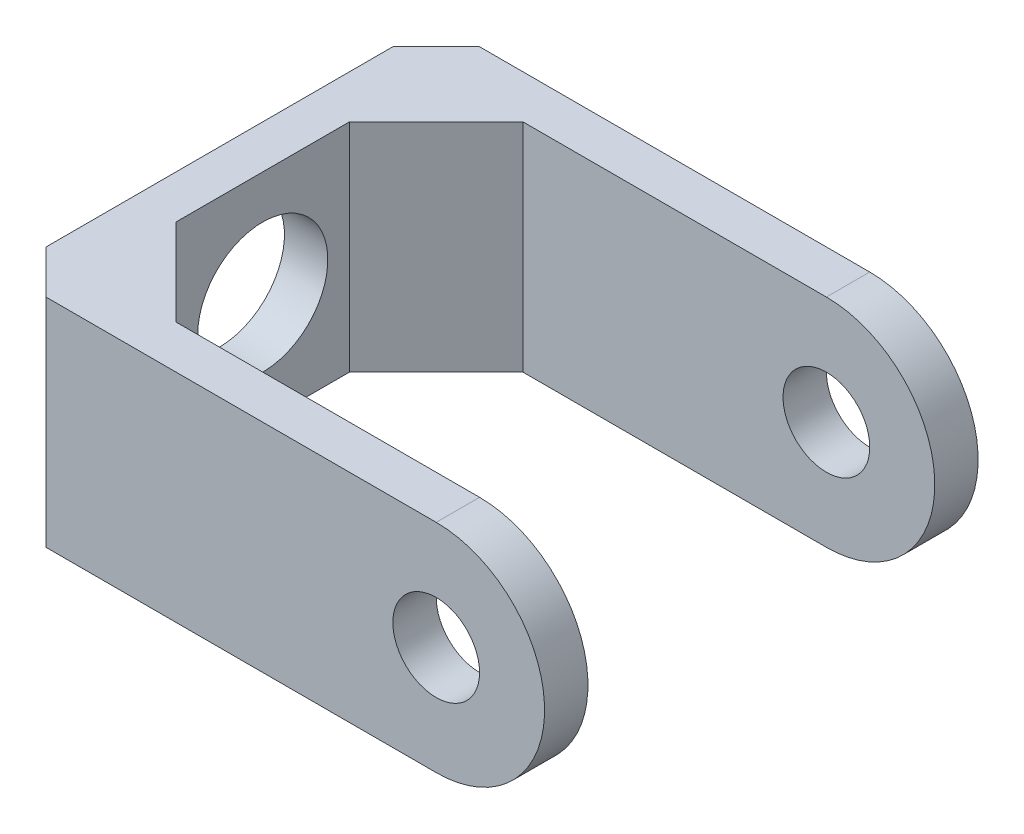
ISO-10303-21;
HEADER;
FILE_DESCRIPTION(('STEP AP214'),'2;1');
FILE_NAME('part.step','',(''),(''),'','','');
FILE_SCHEMA(('AUTOMOTIVE_DESIGN { 1 0 10303 214 1 1 1 1 }'));
ENDSEC;
DATA;
#1=APPLICATION_CONTEXT('core data for automotive mechanical design processes');
#2=APPLICATION_PROTOCOL_DEFINITION('international standard','automotive_design',2000,#1);
#3=PRODUCT_CONTEXT('',#1,'mechanical');
#4=PRODUCT('Part','Part','',(#3));
#5=PRODUCT_RELATED_PRODUCT_CATEGORY('part','',(#4));
#6=PRODUCT_DEFINITION_FORMATION('','',#4);
#7=PRODUCT_DEFINITION_CONTEXT('part definition',#1,'design');
#8=PRODUCT_DEFINITION('design','',#6,#7);
#9=PRODUCT_DEFINITION_SHAPE('','',#8);
#10=(LENGTH_UNIT() NAMED_UNIT(*) SI_UNIT(.MILLI.,.METRE.));
#11=(NAMED_UNIT(*) PLANE_ANGLE_UNIT() SI_UNIT($,.RADIAN.));
#12=(NAMED_UNIT(*) SI_UNIT($,.STERADIAN.) SOLID_ANGLE_UNIT());
#13=UNCERTAINTY_MEASURE_WITH_UNIT(LENGTH_MEASURE(1.E-05),#10,'distance_accuracy_value','');
#14=(GEOMETRIC_REPRESENTATION_CONTEXT(3) GLOBAL_UNCERTAINTY_ASSIGNED_CONTEXT((#13)) GLOBAL_UNIT_ASSIGNED_CONTEXT((#10,
#11,#12)) REPRESENTATION_CONTEXT('',''));
#15=CARTESIAN_POINT('',(0.,0.,0.));
#16=DIRECTION('',(0.,0.,1.));
#17=DIRECTION('',(1.,0.,0.));
#18=AXIS2_PLACEMENT_3D('',#15,#16,#17);
#19=CARTESIAN_POINT('',(18.,5.,2.));
#20=DIRECTION('',(0.,0.,1.));
#21=DIRECTION('',(1.,0.,0.));
#22=AXIS2_PLACEMENT_3D('',#19,#20,#21);
#23=PLANE('',#22);
#24=DIRECTION('',(-1.,0.,0.));
#25=VECTOR('',#24,1.);
#26=CARTESIAN_POINT('',(0.,10.,2.));
#27=LINE('',#26,#25);
#28=CARTESIAN_POINT('',(18.,10.,2.));
#29=VERTEX_POINT('',#28);
#30=CARTESIAN_POINT('',(4.00000000000003,10.,2.));
#31=VERTEX_POINT('',#30);
#32=EDGE_CURVE('E214',#29,#31,#27,.T.);
#33=ORIENTED_EDGE('',*,*,#32,.T.);
#34=DIRECTION('',(0.,-1.,0.));
#35=VECTOR('',#34,1.);
#36=CARTESIAN_POINT('',(4.00000000000003,5.,2.));
#37=LINE('',#36,#35);
#38=CARTESIAN_POINT('',(4.00000000000003,0.,2.));
#39=VERTEX_POINT('',#38);
#40=EDGE_CURVE('E269',#31,#39,#37,.T.);
#41=ORIENTED_EDGE('',*,*,#40,.T.);
#42=DIRECTION('',(1.,0.,0.));
#43=VECTOR('',#42,1.);
#44=CARTESIAN_POINT('',(0.,0.,2.));
#45=LINE('',#44,#43);
#46=CARTESIAN_POINT('',(18.,0.,2.));
#47=VERTEX_POINT('',#46);
#48=EDGE_CURVE('E207',#39,#47,#45,.T.);
#49=ORIENTED_EDGE('',*,*,#48,.T.);
#50=CARTESIAN_POINT('',(18.,5.,2.));
#51=DIRECTION('',(0.,0.,1.));
#52=DIRECTION('',(1.,0.,0.));
#53=AXIS2_PLACEMENT_3D('',#50,#51,#52);
#54=CIRCLE('',#53,5.);
#55=EDGE_CURVE('E210',#47,#29,#54,.T.);
#56=ORIENTED_EDGE('',*,*,#55,.T.);
#57=EDGE_LOOP('',(#33,#41,#49,#56));
#58=FACE_BOUND('',#57,.T.);
#59=CARTESIAN_POINT('',(18.,5.,2.));
#60=DIRECTION('',(0.,0.,1.));
#61=DIRECTION('',(1.,0.,0.));
#62=AXIS2_PLACEMENT_3D('',#59,#60,#61);
#63=CIRCLE('',#62,2.);
#64=CARTESIAN_POINT('',(20.,5.,2.));
#65=VERTEX_POINT('',#64);
#66=EDGE_CURVE('E199',#65,#65,#63,.T.);
#67=ORIENTED_EDGE('',*,*,#66,.F.);
#68=EDGE_LOOP('',(#67));
#69=FACE_BOUND('',#68,.T.);
#70=ADVANCED_FACE('F47',(#58,#69),#23,.T.);
#71=CARTESIAN_POINT('',(18.,5.,0.));
#72=DIRECTION('',(0.,0.,1.));
#73=DIRECTION('',(1.,0.,0.));
#74=AXIS2_PLACEMENT_3D('',#71,#72,#73);
#75=PLANE('',#74);
#76=DIRECTION('',(1.,0.,0.));
#77=VECTOR('',#76,1.);
#78=CARTESIAN_POINT('',(0.,0.,0.));
#79=LINE('',#78,#77);
#80=CARTESIAN_POINT('',(0.,0.,0.));
#81=VERTEX_POINT('',#80);
#82=CARTESIAN_POINT('',(18.,0.,0.));
#83=VERTEX_POINT('',#82);
#84=EDGE_CURVE('E203',#81,#83,#79,.T.);
#85=ORIENTED_EDGE('',*,*,#84,.F.);
#86=DIRECTION('',(0.,1.,0.));
#87=VECTOR('',#86,1.);
#88=CARTESIAN_POINT('',(0.,10.,0.));
#89=LINE('',#88,#87);
#90=CARTESIAN_POINT('',(0.,10.,0.));
#91=VERTEX_POINT('',#90);
#92=EDGE_CURVE('E256',#81,#91,#89,.T.);
#93=ORIENTED_EDGE('',*,*,#92,.T.);
#94=DIRECTION('',(-1.,0.,0.));
#95=VECTOR('',#94,1.);
#96=CARTESIAN_POINT('',(0.,10.,0.));
#97=LINE('',#96,#95);
#98=CARTESIAN_POINT('',(18.,10.,0.));
#99=VERTEX_POINT('',#98);
#100=EDGE_CURVE('E211',#99,#91,#97,.T.);
#101=ORIENTED_EDGE('',*,*,#100,.F.);
#102=CARTESIAN_POINT('',(18.,5.,0.));
#103=DIRECTION('',(0.,0.,1.));
#104=DIRECTION('',(1.,0.,0.));
#105=AXIS2_PLACEMENT_3D('',#102,#103,#104);
#106=CIRCLE('',#105,5.);
#107=EDGE_CURVE('E220',#83,#99,#106,.T.);
#108=ORIENTED_EDGE('',*,*,#107,.F.);
#109=EDGE_LOOP('',(#85,#93,#101,#108));
#110=FACE_BOUND('',#109,.T.);
#111=CARTESIAN_POINT('',(18.,5.,0.));
#112=DIRECTION('',(0.,0.,1.));
#113=DIRECTION('',(1.,0.,0.));
#114=AXIS2_PLACEMENT_3D('',#111,#112,#113);
#115=CIRCLE('',#114,2.);
#116=CARTESIAN_POINT('',(20.,5.,0.));
#117=VERTEX_POINT('',#116);
#118=EDGE_CURVE('E198',#117,#117,#115,.T.);
#119=ORIENTED_EDGE('',*,*,#118,.T.);
#120=EDGE_LOOP('',(#119));
#121=FACE_BOUND('',#120,.T.);
#122=ADVANCED_FACE('F297',(#110,#121),#75,.F.);
#123=CARTESIAN_POINT('',(0.,0.,2.));
#124=DIRECTION('',(0.,1.,0.));
#125=DIRECTION('',(0.,0.,1.));
#126=AXIS2_PLACEMENT_3D('',#123,#124,#125);
#127=PLANE('',#126);
#128=DIRECTION('',(1.,0.,0.));
#129=VECTOR('',#128,1.);
#130=CARTESIAN_POINT('',(-2.,0.,20.));
#131=LINE('',#130,#129);
#132=CARTESIAN_POINT('',(0.,0.,20.));
#133=VERTEX_POINT('',#132);
#134=CARTESIAN_POINT('',(18.,0.,20.));
#135=VERTEX_POINT('',#134);
#136=EDGE_CURVE('E195',#133,#135,#131,.T.);
#137=ORIENTED_EDGE('',*,*,#136,.F.);
#138=DIRECTION('',(-0.707106781186549,0.,-0.707106781186546));
#139=VECTOR('',#138,1.);
#140=CARTESIAN_POINT('',(-2.,0.,18.));
#141=LINE('',#140,#139);
#142=CARTESIAN_POINT('',(-2.,0.,18.));
#143=VERTEX_POINT('',#142);
#144=EDGE_CURVE('E253',#133,#143,#141,.T.);
#145=ORIENTED_EDGE('',*,*,#144,.T.);
#146=DIRECTION('',(0.,0.,1.));
#147=VECTOR('',#146,1.);
#148=CARTESIAN_POINT('',(-2.,0.,0.));
#149=LINE('',#148,#147);
#150=CARTESIAN_POINT('',(-2.,0.,2.));
#151=VERTEX_POINT('',#150);
#152=EDGE_CURVE('E179',#151,#143,#149,.T.);
#153=ORIENTED_EDGE('',*,*,#152,.F.);
#154=DIRECTION('',(0.707106781186549,0.,-0.707106781186546));
#155=VECTOR('',#154,1.);
#156=CARTESIAN_POINT('',(-2.,0.,2.));
#157=LINE('',#156,#155);
#158=EDGE_CURVE('E250',#151,#81,#157,.T.);
#159=ORIENTED_EDGE('',*,*,#158,.T.);
#160=ORIENTED_EDGE('',*,*,#84,.T.);
#161=DIRECTION('',(0.,0.,-1.));
#162=VECTOR('',#161,1.);
#163=CARTESIAN_POINT('',(18.,0.,2.));
#164=LINE('',#163,#162);
#165=EDGE_CURVE('E229',#47,#83,#164,.T.);
#166=ORIENTED_EDGE('',*,*,#165,.F.);
#167=ORIENTED_EDGE('',*,*,#48,.F.);
#168=DIRECTION('',(-0.707106781186551,0.,0.707106781186544));
#169=VECTOR('',#168,1.);
#170=CARTESIAN_POINT('',(1.99999999999999,0.,4.00000000000001));
#171=LINE('',#170,#169);
#172=CARTESIAN_POINT('',(0.,0.,5.99999999999999));
#173=VERTEX_POINT('',#172);
#174=EDGE_CURVE('E58',#39,#173,#171,.T.);
#175=ORIENTED_EDGE('',*,*,#174,.T.);
#176=DIRECTION('',(0.,0.,1.));
#177=VECTOR('',#176,1.);
#178=CARTESIAN_POINT('',(0.,0.,0.));
#179=LINE('',#178,#177);
#180=CARTESIAN_POINT('',(0.,0.,14.));
#181=VERTEX_POINT('',#180);
#182=EDGE_CURVE('E161',#173,#181,#179,.T.);
#183=ORIENTED_EDGE('',*,*,#182,.T.);
#184=DIRECTION('',(0.707106781186544,0.,0.707106781186551));
#185=VECTOR('',#184,1.);
#186=CARTESIAN_POINT('',(-5.99999999999999,0.,7.99999999999992));
#187=LINE('',#186,#185);
#188=CARTESIAN_POINT('',(3.99999999999999,0.,18.));
#189=VERTEX_POINT('',#188);
#190=EDGE_CURVE('E146',#181,#189,#187,.T.);
#191=ORIENTED_EDGE('',*,*,#190,.T.);
#192=DIRECTION('',(1.,0.,0.));
#193=VECTOR('',#192,1.);
#194=CARTESIAN_POINT('',(0.,0.,18.));
#195=LINE('',#194,#193);
#196=CARTESIAN_POINT('',(18.,0.,18.));
#197=VERTEX_POINT('',#196);
#198=EDGE_CURVE('E139',#189,#197,#195,.T.);
#199=ORIENTED_EDGE('',*,*,#198,.T.);
#200=DIRECTION('',(0.,0.,1.));
#201=VECTOR('',#200,1.);
#202=CARTESIAN_POINT('',(18.,0.,18.));
#203=LINE('',#202,#201);
#204=EDGE_CURVE('E143',#197,#135,#203,.T.);
#205=ORIENTED_EDGE('',*,*,#204,.T.);
#206=EDGE_LOOP('',(#137,#145,#153,#159,#160,#166,#167,#175,#183,#191,#199,#205));
#207=FACE_BOUND('',#206,.T.);
#208=ADVANCED_FACE('F142',(#207),#127,.F.);
#209=CARTESIAN_POINT('',(18.,5.,2.));
#210=DIRECTION('',(0.,0.,-1.));
#211=DIRECTION('',(-1.,0.,0.));
#212=AXIS2_PLACEMENT_3D('',#209,#210,#211);
#213=CYLINDRICAL_SURFACE('',#212,5.);
#214=ORIENTED_EDGE('',*,*,#107,.T.);
#215=DIRECTION('',(0.,0.,-1.));
#216=VECTOR('',#215,1.);
#217=CARTESIAN_POINT('',(18.,10.,2.));
#218=LINE('',#217,#216);
#219=EDGE_CURVE('E217',#29,#99,#218,.T.);
#220=ORIENTED_EDGE('',*,*,#219,.F.);
#221=ORIENTED_EDGE('',*,*,#55,.F.);
#222=ORIENTED_EDGE('',*,*,#165,.T.);
#223=EDGE_LOOP('',(#214,#220,#221,#222));
#224=FACE_BOUND('',#223,.T.);
#225=ADVANCED_FACE('F315',(#224),#213,.T.);
#226=CARTESIAN_POINT('',(0.,10.,2.));
#227=DIRECTION('',(0.,-1.,0.));
#228=DIRECTION('',(0.,0.,-1.));
#229=AXIS2_PLACEMENT_3D('',#226,#227,#228);
#230=PLANE('',#229);
#231=DIRECTION('',(0.,0.,-1.));
#232=VECTOR('',#231,1.);
#233=CARTESIAN_POINT('',(-2.,10.,0.));
#234=LINE('',#233,#232);
#235=CARTESIAN_POINT('',(-2.,10.,18.));
#236=VERTEX_POINT('',#235);
#237=CARTESIAN_POINT('',(-2.,10.,2.));
#238=VERTEX_POINT('',#237);
#239=EDGE_CURVE('E183',#236,#238,#234,.T.);
#240=ORIENTED_EDGE('',*,*,#239,.F.);
#241=DIRECTION('',(0.707106781186549,0.,0.707106781186546));
#242=VECTOR('',#241,1.);
#243=CARTESIAN_POINT('',(-2.,10.,18.));
#244=LINE('',#243,#242);
#245=CARTESIAN_POINT('',(0.,10.,20.));
#246=VERTEX_POINT('',#245);
#247=EDGE_CURVE('E244',#236,#246,#244,.T.);
#248=ORIENTED_EDGE('',*,*,#247,.T.);
#249=DIRECTION('',(1.,0.,0.));
#250=VECTOR('',#249,1.);
#251=CARTESIAN_POINT('',(-2.,10.,20.));
#252=LINE('',#251,#250);
#253=CARTESIAN_POINT('',(18.,10.,20.));
#254=VERTEX_POINT('',#253);
#255=EDGE_CURVE('E188',#246,#254,#252,.T.);
#256=ORIENTED_EDGE('',*,*,#255,.T.);
#257=DIRECTION('',(0.,0.,1.));
#258=VECTOR('',#257,1.);
#259=CARTESIAN_POINT('',(18.,10.,18.));
#260=LINE('',#259,#258);
#261=CARTESIAN_POINT('',(18.,10.,18.));
#262=VERTEX_POINT('',#261);
#263=EDGE_CURVE('E162',#262,#254,#260,.T.);
#264=ORIENTED_EDGE('',*,*,#263,.F.);
#265=DIRECTION('',(-1.,0.,0.));
#266=VECTOR('',#265,1.);
#267=CARTESIAN_POINT('',(0.,10.,18.));
#268=LINE('',#267,#266);
#269=CARTESIAN_POINT('',(3.99999999999999,10.,18.));
#270=VERTEX_POINT('',#269);
#271=EDGE_CURVE('E167',#262,#270,#268,.T.);
#272=ORIENTED_EDGE('',*,*,#271,.T.);
#273=DIRECTION('',(-0.707106781186544,0.,-0.707106781186551));
#274=VECTOR('',#273,1.);
#275=CARTESIAN_POINT('',(-5.99999999999999,10.,7.99999999999992));
#276=LINE('',#275,#274);
#277=CARTESIAN_POINT('',(0.,10.,14.));
#278=VERTEX_POINT('',#277);
#279=EDGE_CURVE('E274',#270,#278,#276,.T.);
#280=ORIENTED_EDGE('',*,*,#279,.T.);
#281=DIRECTION('',(0.,0.,-1.));
#282=VECTOR('',#281,1.);
#283=CARTESIAN_POINT('',(0.,10.,0.));
#284=LINE('',#283,#282);
#285=CARTESIAN_POINT('',(0.,10.,5.99999999999999));
#286=VERTEX_POINT('',#285);
#287=EDGE_CURVE('E184',#278,#286,#284,.T.);
#288=ORIENTED_EDGE('',*,*,#287,.T.);
#289=DIRECTION('',(0.707106781186551,0.,-0.707106781186544));
#290=VECTOR('',#289,1.);
#291=CARTESIAN_POINT('',(1.99999999999999,10.,4.00000000000001));
#292=LINE('',#291,#290);
#293=EDGE_CURVE('E11',#286,#31,#292,.T.);
#294=ORIENTED_EDGE('',*,*,#293,.T.);
#295=ORIENTED_EDGE('',*,*,#32,.F.);
#296=ORIENTED_EDGE('',*,*,#219,.T.);
#297=ORIENTED_EDGE('',*,*,#100,.T.);
#298=DIRECTION('',(-0.707106781186549,0.,0.707106781186546));
#299=VECTOR('',#298,1.);
#300=CARTESIAN_POINT('',(-2.,10.,2.));
#301=LINE('',#300,#299);
#302=EDGE_CURVE('E241',#91,#238,#301,.T.);
#303=ORIENTED_EDGE('',*,*,#302,.T.);
#304=EDGE_LOOP('',(#240,#248,#256,#264,#272,#280,#288,#294,#295,#296,#297,#303));
#305=FACE_BOUND('',#304,.T.);
#306=ADVANCED_FACE('F290',(#305),#230,.F.);
#307=CARTESIAN_POINT('',(18.,5.,2.));
#308=DIRECTION('',(0.,0.,-1.));
#309=DIRECTION('',(-1.,0.,0.));
#310=AXIS2_PLACEMENT_3D('',#307,#308,#309);
#311=CYLINDRICAL_SURFACE('',#310,2.);
#312=ORIENTED_EDGE('',*,*,#66,.T.);
#313=EDGE_LOOP('',(#312));
#314=FACE_BOUND('',#313,.T.);
#315=ORIENTED_EDGE('',*,*,#118,.F.);
#316=EDGE_LOOP('',(#315));
#317=FACE_BOUND('',#316,.T.);
#318=ADVANCED_FACE('F322',(#314,#317),#311,.F.);
#319=CARTESIAN_POINT('',(-2.,10.,20.));
#320=DIRECTION('',(0.,0.,-1.));
#321=DIRECTION('',(-1.,0.,0.));
#322=AXIS2_PLACEMENT_3D('',#319,#320,#321);
#323=PLANE('',#322);
#324=ORIENTED_EDGE('',*,*,#255,.F.);
#325=DIRECTION('',(0.,-1.,0.));
#326=VECTOR('',#325,1.);
#327=CARTESIAN_POINT('',(0.,0.,20.));
#328=LINE('',#327,#326);
#329=EDGE_CURVE('E247',#246,#133,#328,.T.);
#330=ORIENTED_EDGE('',*,*,#329,.T.);
#331=ORIENTED_EDGE('',*,*,#136,.T.);
#332=CARTESIAN_POINT('',(18.,5.,20.));
#333=DIRECTION('',(0.,0.,1.));
#334=DIRECTION('',(1.,0.,0.));
#335=AXIS2_PLACEMENT_3D('',#332,#333,#334);
#336=CIRCLE('',#335,5.);
#337=EDGE_CURVE('E152',#135,#254,#336,.T.);
#338=ORIENTED_EDGE('',*,*,#337,.T.);
#339=EDGE_LOOP('',(#324,#330,#331,#338));
#340=FACE_BOUND('',#339,.T.);
#341=CARTESIAN_POINT('',(18.,5.,20.));
#342=DIRECTION('',(0.,0.,1.));
#343=DIRECTION('',(1.,0.,0.));
#344=AXIS2_PLACEMENT_3D('',#341,#342,#343);
#345=CIRCLE('',#344,2.);
#346=CARTESIAN_POINT('',(20.,5.,20.));
#347=VERTEX_POINT('',#346);
#348=EDGE_CURVE('E366',#347,#347,#345,.T.);
#349=ORIENTED_EDGE('',*,*,#348,.F.);
#350=EDGE_LOOP('',(#349));
#351=FACE_BOUND('',#350,.T.);
#352=ADVANCED_FACE('F313',(#340,#351),#323,.F.);
#353=CARTESIAN_POINT('',(-2.,0.,0.));
#354=DIRECTION('',(-1.,0.,0.));
#355=DIRECTION('',(0.,0.,1.));
#356=AXIS2_PLACEMENT_3D('',#353,#354,#355);
#357=PLANE('',#356);
#358=CARTESIAN_POINT('',(-2.,5.,10.));
#359=DIRECTION('',(-1.,0.,0.));
#360=DIRECTION('',(0.,0.,1.));
#361=AXIS2_PLACEMENT_3D('',#358,#359,#360);
#362=CIRCLE('',#361,3.);
#363=CARTESIAN_POINT('',(-2.,5.,13.));
#364=VERTEX_POINT('',#363);
#365=EDGE_CURVE('E362',#364,#364,#362,.T.);
#366=ORIENTED_EDGE('',*,*,#365,.F.);
#367=EDGE_LOOP('',(#366));
#368=FACE_BOUND('',#367,.T.);
#369=ORIENTED_EDGE('',*,*,#152,.T.);
#370=DIRECTION('',(0.,1.,0.));
#371=VECTOR('',#370,1.);
#372=CARTESIAN_POINT('',(-2.,10.,18.));
#373=LINE('',#372,#371);
#374=EDGE_CURVE('E237',#143,#236,#373,.T.);
#375=ORIENTED_EDGE('',*,*,#374,.T.);
#376=ORIENTED_EDGE('',*,*,#239,.T.);
#377=DIRECTION('',(0.,-1.,0.));
#378=VECTOR('',#377,1.);
#379=CARTESIAN_POINT('',(-2.,0.,2.));
#380=LINE('',#379,#378);
#381=EDGE_CURVE('E233',#238,#151,#380,.T.);
#382=ORIENTED_EDGE('',*,*,#381,.T.);
#383=EDGE_LOOP('',(#369,#375,#376,#382));
#384=FACE_BOUND('',#383,.T.);
#385=ADVANCED_FACE('F304',(#368,#384),#357,.T.);
#386=CARTESIAN_POINT('',(0.,0.,0.));
#387=DIRECTION('',(-1.,0.,0.));
#388=DIRECTION('',(0.,0.,1.));
#389=AXIS2_PLACEMENT_3D('',#386,#387,#388);
#390=PLANE('',#389);
#391=CARTESIAN_POINT('',(0.,5.,10.));
#392=DIRECTION('',(-1.,0.,0.));
#393=DIRECTION('',(0.,0.,1.));
#394=AXIS2_PLACEMENT_3D('',#391,#392,#393);
#395=CIRCLE('',#394,3.);
#396=CARTESIAN_POINT('',(0.,5.,13.));
#397=VERTEX_POINT('',#396);
#398=EDGE_CURVE('E52',#397,#397,#395,.T.);
#399=ORIENTED_EDGE('',*,*,#398,.T.);
#400=EDGE_LOOP('',(#399));
#401=FACE_BOUND('',#400,.T.);
#402=ORIENTED_EDGE('',*,*,#287,.F.);
#403=DIRECTION('',(0.,-1.,0.));
#404=VECTOR('',#403,1.);
#405=CARTESIAN_POINT('',(0.,0.,14.));
#406=LINE('',#405,#404);
#407=EDGE_CURVE('E262',#278,#181,#406,.T.);
#408=ORIENTED_EDGE('',*,*,#407,.T.);
#409=ORIENTED_EDGE('',*,*,#182,.F.);
#410=DIRECTION('',(0.,1.,0.));
#411=VECTOR('',#410,1.);
#412=CARTESIAN_POINT('',(0.,0.,5.99999999999999));
#413=LINE('',#412,#411);
#414=EDGE_CURVE('E259',#173,#286,#413,.T.);
#415=ORIENTED_EDGE('',*,*,#414,.T.);
#416=EDGE_LOOP('',(#402,#408,#409,#415));
#417=FACE_BOUND('',#416,.T.);
#418=ADVANCED_FACE('F283',(#401,#417),#390,.F.);
#419=CARTESIAN_POINT('',(18.,5.,18.));
#420=DIRECTION('',(0.,0.,-1.));
#421=DIRECTION('',(1.,0.,0.));
#422=AXIS2_PLACEMENT_3D('',#419,#420,#421);
#423=PLANE('',#422);
#424=ORIENTED_EDGE('',*,*,#198,.F.);
#425=DIRECTION('',(0.,1.,0.));
#426=VECTOR('',#425,1.);
#427=CARTESIAN_POINT('',(3.99999999999999,5.,18.));
#428=LINE('',#427,#426);
#429=EDGE_CURVE('E266',#189,#270,#428,.T.);
#430=ORIENTED_EDGE('',*,*,#429,.T.);
#431=ORIENTED_EDGE('',*,*,#271,.F.);
#432=CARTESIAN_POINT('',(18.,5.,18.));
#433=DIRECTION('',(0.,0.,1.));
#434=DIRECTION('',(1.,0.,0.));
#435=AXIS2_PLACEMENT_3D('',#432,#433,#434);
#436=CIRCLE('',#435,5.);
#437=EDGE_CURVE('E151',#197,#262,#436,.T.);
#438=ORIENTED_EDGE('',*,*,#437,.F.);
#439=EDGE_LOOP('',(#424,#430,#431,#438));
#440=FACE_BOUND('',#439,.T.);
#441=CARTESIAN_POINT('',(18.,5.,18.));
#442=DIRECTION('',(0.,0.,1.));
#443=DIRECTION('',(1.,0.,0.));
#444=AXIS2_PLACEMENT_3D('',#441,#442,#443);
#445=CIRCLE('',#444,2.);
#446=CARTESIAN_POINT('',(20.,5.,18.));
#447=VERTEX_POINT('',#446);
#448=EDGE_CURVE('E176',#447,#447,#445,.T.);
#449=ORIENTED_EDGE('',*,*,#448,.T.);
#450=EDGE_LOOP('',(#449));
#451=FACE_BOUND('',#450,.T.);
#452=ADVANCED_FACE('F164',(#440,#451),#423,.T.);
#453=CARTESIAN_POINT('',(18.,5.,18.));
#454=DIRECTION('',(0.,0.,1.));
#455=DIRECTION('',(-1.,0.,0.));
#456=AXIS2_PLACEMENT_3D('',#453,#454,#455);
#457=CYLINDRICAL_SURFACE('',#456,5.);
#458=ORIENTED_EDGE('',*,*,#337,.F.);
#459=ORIENTED_EDGE('',*,*,#204,.F.);
#460=ORIENTED_EDGE('',*,*,#437,.T.);
#461=ORIENTED_EDGE('',*,*,#263,.T.);
#462=EDGE_LOOP('',(#458,#459,#460,#461));
#463=FACE_BOUND('',#462,.T.);
#464=ADVANCED_FACE('F156',(#463),#457,.T.);
#465=CARTESIAN_POINT('',(18.,5.,18.));
#466=DIRECTION('',(0.,0.,1.));
#467=DIRECTION('',(-1.,0.,0.));
#468=AXIS2_PLACEMENT_3D('',#465,#466,#467);
#469=CYLINDRICAL_SURFACE('',#468,2.);
#470=ORIENTED_EDGE('',*,*,#448,.F.);
#471=EDGE_LOOP('',(#470));
#472=FACE_BOUND('',#471,.T.);
#473=ORIENTED_EDGE('',*,*,#348,.T.);
#474=EDGE_LOOP('',(#473));
#475=FACE_BOUND('',#474,.T.);
#476=ADVANCED_FACE('F346',(#472,#475),#469,.F.);
#477=CARTESIAN_POINT('',(-2.,0.,18.));
#478=DIRECTION('',(-0.707106781186546,0.,0.707106781186549));
#479=DIRECTION('',(0.,-1.,0.));
#480=AXIS2_PLACEMENT_3D('',#477,#478,#479);
#481=PLANE('',#480);
#482=ORIENTED_EDGE('',*,*,#144,.F.);
#483=ORIENTED_EDGE('',*,*,#329,.F.);
#484=ORIENTED_EDGE('',*,*,#247,.F.);
#485=ORIENTED_EDGE('',*,*,#374,.F.);
#486=EDGE_LOOP('',(#482,#483,#484,#485));
#487=FACE_BOUND('',#486,.T.);
#488=ADVANCED_FACE('F309',(#487),#481,.T.);
#489=CARTESIAN_POINT('',(-2.,0.,2.));
#490=DIRECTION('',(-0.707106781186546,0.,-0.707106781186549));
#491=DIRECTION('',(0.,1.,0.));
#492=AXIS2_PLACEMENT_3D('',#489,#490,#491);
#493=PLANE('',#492);
#494=ORIENTED_EDGE('',*,*,#302,.F.);
#495=ORIENTED_EDGE('',*,*,#92,.F.);
#496=ORIENTED_EDGE('',*,*,#158,.F.);
#497=ORIENTED_EDGE('',*,*,#381,.F.);
#498=EDGE_LOOP('',(#494,#495,#496,#497));
#499=FACE_BOUND('',#498,.T.);
#500=ADVANCED_FACE('F301',(#499),#493,.T.);
#501=CARTESIAN_POINT('',(0.,0.,14.));
#502=DIRECTION('',(-0.707106781186551,0.,0.707106781186544));
#503=DIRECTION('',(0.,-1.,0.));
#504=AXIS2_PLACEMENT_3D('',#501,#502,#503);
#505=PLANE('',#504);
#506=ORIENTED_EDGE('',*,*,#279,.F.);
#507=ORIENTED_EDGE('',*,*,#429,.F.);
#508=ORIENTED_EDGE('',*,*,#190,.F.);
#509=ORIENTED_EDGE('',*,*,#407,.F.);
#510=EDGE_LOOP('',(#506,#507,#508,#509));
#511=FACE_BOUND('',#510,.T.);
#512=ADVANCED_FACE('F358',(#511),#505,.F.);
#513=CARTESIAN_POINT('',(4.00000000000003,5.,2.));
#514=DIRECTION('',(-0.707106781186544,0.,-0.707106781186551));
#515=DIRECTION('',(0.,-1.,0.));
#516=AXIS2_PLACEMENT_3D('',#513,#514,#515);
#517=PLANE('',#516);
#518=ORIENTED_EDGE('',*,*,#293,.F.);
#519=ORIENTED_EDGE('',*,*,#414,.F.);
#520=ORIENTED_EDGE('',*,*,#174,.F.);
#521=ORIENTED_EDGE('',*,*,#40,.F.);
#522=EDGE_LOOP('',(#518,#519,#520,#521));
#523=FACE_BOUND('',#522,.T.);
#524=ADVANCED_FACE('F50',(#523),#517,.F.);
#525=CARTESIAN_POINT('',(23.,5.,10.));
#526=DIRECTION('',(-1.,0.,0.));
#527=DIRECTION('',(0.,0.,1.));
#528=AXIS2_PLACEMENT_3D('',#525,#526,#527);
#529=CYLINDRICAL_SURFACE('',#528,3.);
#530=ORIENTED_EDGE('',*,*,#365,.T.);
#531=EDGE_LOOP('',(#530));
#532=FACE_BOUND('',#531,.T.);
#533=ORIENTED_EDGE('',*,*,#398,.F.);
#534=EDGE_LOOP('',(#533));
#535=FACE_BOUND('',#534,.T.);
#536=ADVANCED_FACE('F352',(#532,#535),#529,.F.);
#537=CLOSED_SHELL('',(#70,#122,#208,#225,#306,#318,#352,#385,#418,#452,#464,#476,#488,#500,#512,
#524,#536));
#538=MANIFOLD_SOLID_BREP('B2',#537);
#539=ADVANCED_BREP_SHAPE_REPRESENTATION('',(#18,#538),#14);
#540=SHAPE_DEFINITION_REPRESENTATION(#9,#539);
ENDSEC;
END-ISO-10303-21;
